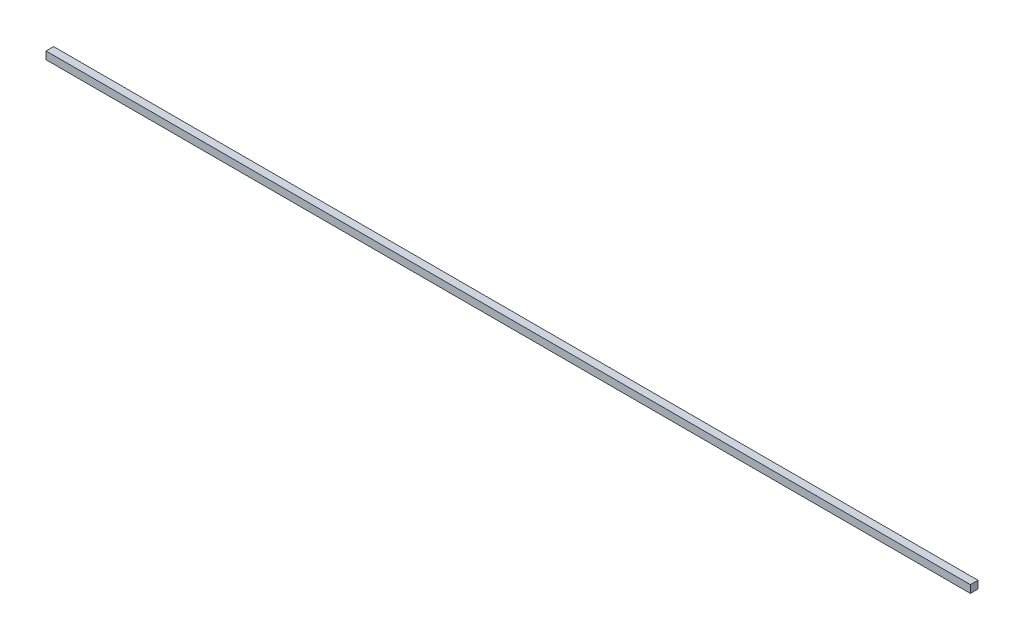
ISO-10303-21;
HEADER;
FILE_DESCRIPTION(('STEP AP214'),'2;1');
FILE_NAME('part.step','',(''),(''),'','','');
FILE_SCHEMA(('AUTOMOTIVE_DESIGN { 1 0 10303 214 1 1 1 1 }'));
ENDSEC;
DATA;
#1=APPLICATION_CONTEXT('core data for automotive mechanical design processes');
#2=APPLICATION_PROTOCOL_DEFINITION('international standard','automotive_design',2000,#1);
#3=PRODUCT_CONTEXT('',#1,'mechanical');
#4=PRODUCT('Part','Part','',(#3));
#5=PRODUCT_RELATED_PRODUCT_CATEGORY('part','',(#4));
#6=PRODUCT_DEFINITION_FORMATION('','',#4);
#7=PRODUCT_DEFINITION_CONTEXT('part definition',#1,'design');
#8=PRODUCT_DEFINITION('design','',#6,#7);
#9=PRODUCT_DEFINITION_SHAPE('','',#8);
#10=(LENGTH_UNIT() NAMED_UNIT(*) SI_UNIT(.MILLI.,.METRE.));
#11=(NAMED_UNIT(*) PLANE_ANGLE_UNIT() SI_UNIT($,.RADIAN.));
#12=(NAMED_UNIT(*) SI_UNIT($,.STERADIAN.) SOLID_ANGLE_UNIT());
#13=UNCERTAINTY_MEASURE_WITH_UNIT(LENGTH_MEASURE(1.E-05),#10,'distance_accuracy_value','');
#14=(GEOMETRIC_REPRESENTATION_CONTEXT(3) GLOBAL_UNCERTAINTY_ASSIGNED_CONTEXT((#13)) GLOBAL_UNIT_ASSIGNED_CONTEXT((#10,
#11,#12)) REPRESENTATION_CONTEXT('',''));
#15=CARTESIAN_POINT('',(0.,0.,0.));
#16=DIRECTION('',(0.,0.,1.));
#17=DIRECTION('',(1.,0.,0.));
#18=AXIS2_PLACEMENT_3D('',#15,#16,#17);
#19=CARTESIAN_POINT('',(-121.5,2.,1.00000000000002));
#20=DIRECTION('',(1.,0.,0.));
#21=DIRECTION('',(0.,0.,-1.));
#22=AXIS2_PLACEMENT_3D('',#19,#20,#21);
#23=PLANE('',#22);
#24=DIRECTION('',(0.,0.,1.));
#25=VECTOR('',#24,1.);
#26=CARTESIAN_POINT('',(-121.5,0.,1.00000000000002));
#27=LINE('',#26,#25);
#28=CARTESIAN_POINT('',(-121.5,0.,-0.999999999999984));
#29=VERTEX_POINT('',#28);
#30=CARTESIAN_POINT('',(-121.5,0.,1.00000000000002));
#31=VERTEX_POINT('',#30);
#32=EDGE_CURVE('E97',#29,#31,#27,.T.);
#33=ORIENTED_EDGE('',*,*,#32,.T.);
#34=DIRECTION('',(0.,-1.,0.));
#35=VECTOR('',#34,1.);
#36=CARTESIAN_POINT('',(-121.5,2.,1.00000000000002));
#37=LINE('',#36,#35);
#38=CARTESIAN_POINT('',(-121.5,2.,1.00000000000002));
#39=VERTEX_POINT('',#38);
#40=EDGE_CURVE('E11',#39,#31,#37,.T.);
#41=ORIENTED_EDGE('',*,*,#40,.F.);
#42=DIRECTION('',(0.,0.,1.));
#43=VECTOR('',#42,1.);
#44=CARTESIAN_POINT('',(-121.5,2.,1.00000000000002));
#45=LINE('',#44,#43);
#46=CARTESIAN_POINT('',(-121.5,2.,-0.999999999999984));
#47=VERTEX_POINT('',#46);
#48=EDGE_CURVE('E85',#47,#39,#45,.T.);
#49=ORIENTED_EDGE('',*,*,#48,.F.);
#50=DIRECTION('',(0.,-1.,0.));
#51=VECTOR('',#50,1.);
#52=CARTESIAN_POINT('',(-121.5,2.,-0.999999999999984));
#53=LINE('',#52,#51);
#54=EDGE_CURVE('E93',#47,#29,#53,.T.);
#55=ORIENTED_EDGE('',*,*,#54,.T.);
#56=EDGE_LOOP('',(#33,#41,#49,#55));
#57=FACE_BOUND('',#56,.T.);
#58=ADVANCED_FACE('F34',(#57),#23,.F.);
#59=CARTESIAN_POINT('',(121.5,2.,0.999999999999986));
#60=DIRECTION('',(0.,0.,-1.));
#61=DIRECTION('',(-1.,0.,0.));
#62=AXIS2_PLACEMENT_3D('',#59,#60,#61);
#63=PLANE('',#62);
#64=DIRECTION('',(1.,0.,0.));
#65=VECTOR('',#64,1.);
#66=CARTESIAN_POINT('',(121.5,0.,0.999999999999986));
#67=LINE('',#66,#65);
#68=CARTESIAN_POINT('',(121.5,0.,0.999999999999986));
#69=VERTEX_POINT('',#68);
#70=EDGE_CURVE('E89',#31,#69,#67,.T.);
#71=ORIENTED_EDGE('',*,*,#70,.T.);
#72=DIRECTION('',(0.,-1.,0.));
#73=VECTOR('',#72,1.);
#74=CARTESIAN_POINT('',(121.5,2.,0.999999999999986));
#75=LINE('',#74,#73);
#76=CARTESIAN_POINT('',(121.5,2.,0.999999999999986));
#77=VERTEX_POINT('',#76);
#78=EDGE_CURVE('E42',#77,#69,#75,.T.);
#79=ORIENTED_EDGE('',*,*,#78,.F.);
#80=DIRECTION('',(1.,0.,0.));
#81=VECTOR('',#80,1.);
#82=CARTESIAN_POINT('',(121.5,2.,0.999999999999986));
#83=LINE('',#82,#81);
#84=EDGE_CURVE('E80',#39,#77,#83,.T.);
#85=ORIENTED_EDGE('',*,*,#84,.F.);
#86=ORIENTED_EDGE('',*,*,#40,.T.);
#87=EDGE_LOOP('',(#71,#79,#85,#86));
#88=FACE_BOUND('',#87,.T.);
#89=ADVANCED_FACE('F88',(#88),#63,.F.);
#90=CARTESIAN_POINT('',(121.5,2.,0.999999999999986));
#91=DIRECTION('',(-1.,0.,0.));
#92=DIRECTION('',(0.,0.,1.));
#93=AXIS2_PLACEMENT_3D('',#90,#91,#92);
#94=PLANE('',#93);
#95=DIRECTION('',(0.,0.,-1.));
#96=VECTOR('',#95,1.);
#97=CARTESIAN_POINT('',(121.5,0.,0.999999999999986));
#98=LINE('',#97,#96);
#99=CARTESIAN_POINT('',(121.5,0.,-1.00000000000001));
#100=VERTEX_POINT('',#99);
#101=EDGE_CURVE('E67',#69,#100,#98,.T.);
#102=ORIENTED_EDGE('',*,*,#101,.T.);
#103=DIRECTION('',(0.,-1.,0.));
#104=VECTOR('',#103,1.);
#105=CARTESIAN_POINT('',(121.5,2.,-1.00000000000001));
#106=LINE('',#105,#104);
#107=CARTESIAN_POINT('',(121.5,2.,-1.00000000000001));
#108=VERTEX_POINT('',#107);
#109=EDGE_CURVE('E90',#108,#100,#106,.T.);
#110=ORIENTED_EDGE('',*,*,#109,.F.);
#111=DIRECTION('',(0.,0.,-1.));
#112=VECTOR('',#111,1.);
#113=CARTESIAN_POINT('',(121.5,2.,0.999999999999986));
#114=LINE('',#113,#112);
#115=EDGE_CURVE('E83',#77,#108,#114,.T.);
#116=ORIENTED_EDGE('',*,*,#115,.F.);
#117=ORIENTED_EDGE('',*,*,#78,.T.);
#118=EDGE_LOOP('',(#102,#110,#116,#117));
#119=FACE_BOUND('',#118,.T.);
#120=ADVANCED_FACE('F91',(#119),#94,.F.);
#121=CARTESIAN_POINT('',(121.5,2.,-1.00000000000001));
#122=DIRECTION('',(0.,0.,1.));
#123=DIRECTION('',(1.,0.,0.));
#124=AXIS2_PLACEMENT_3D('',#121,#122,#123);
#125=PLANE('',#124);
#126=DIRECTION('',(-1.,0.,0.));
#127=VECTOR('',#126,1.);
#128=CARTESIAN_POINT('',(121.5,0.,-1.00000000000001));
#129=LINE('',#128,#127);
#130=EDGE_CURVE('E73',#100,#29,#129,.T.);
#131=ORIENTED_EDGE('',*,*,#130,.T.);
#132=ORIENTED_EDGE('',*,*,#54,.F.);
#133=DIRECTION('',(-1.,0.,0.));
#134=VECTOR('',#133,1.);
#135=CARTESIAN_POINT('',(121.5,2.,-1.00000000000001));
#136=LINE('',#135,#134);
#137=EDGE_CURVE('E50',#108,#47,#136,.T.);
#138=ORIENTED_EDGE('',*,*,#137,.F.);
#139=ORIENTED_EDGE('',*,*,#109,.T.);
#140=EDGE_LOOP('',(#131,#132,#138,#139));
#141=FACE_BOUND('',#140,.T.);
#142=ADVANCED_FACE('F104',(#141),#125,.F.);
#143=CARTESIAN_POINT('',(0.,2.,0.));
#144=DIRECTION('',(0.,1.,0.));
#145=DIRECTION('',(0.,0.,1.));
#146=AXIS2_PLACEMENT_3D('',#143,#144,#145);
#147=PLANE('',#146);
#148=ORIENTED_EDGE('',*,*,#48,.T.);
#149=ORIENTED_EDGE('',*,*,#84,.T.);
#150=ORIENTED_EDGE('',*,*,#115,.T.);
#151=ORIENTED_EDGE('',*,*,#137,.T.);
#152=EDGE_LOOP('',(#148,#149,#150,#151));
#153=FACE_BOUND('',#152,.T.);
#154=ADVANCED_FACE('F81',(#153),#147,.T.);
#155=CARTESIAN_POINT('',(0.,0.,0.));
#156=DIRECTION('',(0.,1.,0.));
#157=DIRECTION('',(0.,0.,1.));
#158=AXIS2_PLACEMENT_3D('',#155,#156,#157);
#159=PLANE('',#158);
#160=ORIENTED_EDGE('',*,*,#32,.F.);
#161=ORIENTED_EDGE('',*,*,#130,.F.);
#162=ORIENTED_EDGE('',*,*,#101,.F.);
#163=ORIENTED_EDGE('',*,*,#70,.F.);
#164=EDGE_LOOP('',(#160,#161,#162,#163));
#165=FACE_BOUND('',#164,.T.);
#166=ADVANCED_FACE('F107',(#165),#159,.F.);
#167=CLOSED_SHELL('',(#58,#89,#120,#142,#154,#166));
#168=MANIFOLD_SOLID_BREP('B2',#167);
#169=ADVANCED_BREP_SHAPE_REPRESENTATION('',(#18,#168),#14);
#170=SHAPE_DEFINITION_REPRESENTATION(#9,#169);
ENDSEC;
END-ISO-10303-21;
